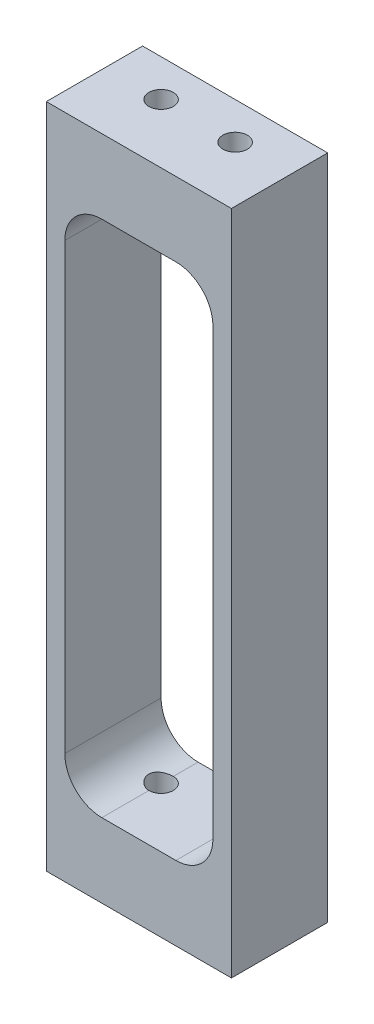
ISO-10303-21;
HEADER;
FILE_DESCRIPTION(('STEP AP214'),'2;1');
FILE_NAME('part.step','',(''),(''),'','','');
FILE_SCHEMA(('AUTOMOTIVE_DESIGN { 1 0 10303 214 1 1 1 1 }'));
ENDSEC;
DATA;
#1=APPLICATION_CONTEXT('core data for automotive mechanical design processes');
#2=APPLICATION_PROTOCOL_DEFINITION('international standard','automotive_design',2000,#1);
#3=PRODUCT_CONTEXT('',#1,'mechanical');
#4=PRODUCT('Part','Part','',(#3));
#5=PRODUCT_RELATED_PRODUCT_CATEGORY('part','',(#4));
#6=PRODUCT_DEFINITION_FORMATION('','',#4);
#7=PRODUCT_DEFINITION_CONTEXT('part definition',#1,'design');
#8=PRODUCT_DEFINITION('design','',#6,#7);
#9=PRODUCT_DEFINITION_SHAPE('','',#8);
#10=(LENGTH_UNIT() NAMED_UNIT(*) SI_UNIT(.MILLI.,.METRE.));
#11=(NAMED_UNIT(*) PLANE_ANGLE_UNIT() SI_UNIT($,.RADIAN.));
#12=(NAMED_UNIT(*) SI_UNIT($,.STERADIAN.) SOLID_ANGLE_UNIT());
#13=UNCERTAINTY_MEASURE_WITH_UNIT(LENGTH_MEASURE(1.E-05),#10,'distance_accuracy_value','');
#14=(GEOMETRIC_REPRESENTATION_CONTEXT(3) GLOBAL_UNCERTAINTY_ASSIGNED_CONTEXT((#13)) GLOBAL_UNIT_ASSIGNED_CONTEXT((#10,
#11,#12)) REPRESENTATION_CONTEXT('',''));
#15=CARTESIAN_POINT('',(0.,0.,0.));
#16=DIRECTION('',(0.,0.,1.));
#17=DIRECTION('',(1.,0.,0.));
#18=AXIS2_PLACEMENT_3D('',#15,#16,#17);
#19=CARTESIAN_POINT('',(12.5,-45.,13.));
#20=DIRECTION('',(-1.,0.,0.));
#21=DIRECTION('',(0.,0.,1.));
#22=AXIS2_PLACEMENT_3D('',#19,#20,#21);
#23=PLANE('',#22);
#24=DIRECTION('',(0.,1.,0.));
#25=VECTOR('',#24,1.);
#26=CARTESIAN_POINT('',(12.5,-45.,0.));
#27=LINE('',#26,#25);
#28=CARTESIAN_POINT('',(12.5,-45.,0.));
#29=VERTEX_POINT('',#28);
#30=CARTESIAN_POINT('',(12.5,45.,0.));
#31=VERTEX_POINT('',#30);
#32=EDGE_CURVE('E287',#29,#31,#27,.T.);
#33=ORIENTED_EDGE('',*,*,#32,.T.);
#34=DIRECTION('',(0.,0.,-1.));
#35=VECTOR('',#34,1.);
#36=CARTESIAN_POINT('',(12.5,45.,13.));
#37=LINE('',#36,#35);
#38=CARTESIAN_POINT('',(12.5,45.,13.));
#39=VERTEX_POINT('',#38);
#40=EDGE_CURVE('E325',#39,#31,#37,.T.);
#41=ORIENTED_EDGE('',*,*,#40,.F.);
#42=DIRECTION('',(0.,1.,0.));
#43=VECTOR('',#42,1.);
#44=CARTESIAN_POINT('',(12.5,-45.,13.));
#45=LINE('',#44,#43);
#46=CARTESIAN_POINT('',(12.5,-45.,13.));
#47=VERTEX_POINT('',#46);
#48=EDGE_CURVE('E288',#47,#39,#45,.T.);
#49=ORIENTED_EDGE('',*,*,#48,.F.);
#50=DIRECTION('',(0.,0.,-1.));
#51=VECTOR('',#50,1.);
#52=CARTESIAN_POINT('',(12.5,-45.,13.));
#53=LINE('',#52,#51);
#54=EDGE_CURVE('E302',#47,#29,#53,.T.);
#55=ORIENTED_EDGE('',*,*,#54,.T.);
#56=EDGE_LOOP('',(#33,#41,#49,#55));
#57=FACE_BOUND('',#56,.T.);
#58=ADVANCED_FACE('F43',(#57),#23,.F.);
#59=CARTESIAN_POINT('',(-12.5,45.,13.));
#60=DIRECTION('',(0.,-1.,0.));
#61=DIRECTION('',(0.,0.,-1.));
#62=AXIS2_PLACEMENT_3D('',#59,#60,#61);
#63=PLANE('',#62);
#64=CARTESIAN_POINT('',(5.,45.,5.));
#65=DIRECTION('',(0.,-1.,0.));
#66=DIRECTION('',(0.,0.,-1.));
#67=AXIS2_PLACEMENT_3D('',#64,#65,#66);
#68=CIRCLE('',#67,1.64999999999999);
#69=CARTESIAN_POINT('',(5.,45.,3.35000000000001));
#70=VERTEX_POINT('',#69);
#71=EDGE_CURVE('E174',#70,#70,#68,.T.);
#72=ORIENTED_EDGE('',*,*,#71,.T.);
#73=EDGE_LOOP('',(#72));
#74=FACE_BOUND('',#73,.T.);
#75=CARTESIAN_POINT('',(-5.,45.,5.));
#76=DIRECTION('',(0.,-1.,0.));
#77=DIRECTION('',(0.,0.,-1.));
#78=AXIS2_PLACEMENT_3D('',#75,#76,#77);
#79=CIRCLE('',#78,1.64999999999999);
#80=CARTESIAN_POINT('',(-5.,45.,3.35000000000001));
#81=VERTEX_POINT('',#80);
#82=EDGE_CURVE('E382',#81,#81,#79,.T.);
#83=ORIENTED_EDGE('',*,*,#82,.T.);
#84=EDGE_LOOP('',(#83));
#85=FACE_BOUND('',#84,.T.);
#86=DIRECTION('',(-1.,0.,0.));
#87=VECTOR('',#86,1.);
#88=CARTESIAN_POINT('',(-12.5,45.,0.));
#89=LINE('',#88,#87);
#90=CARTESIAN_POINT('',(-12.5,45.,0.));
#91=VERTEX_POINT('',#90);
#92=EDGE_CURVE('E306',#31,#91,#89,.T.);
#93=ORIENTED_EDGE('',*,*,#92,.T.);
#94=DIRECTION('',(0.,0.,-1.));
#95=VECTOR('',#94,1.);
#96=CARTESIAN_POINT('',(-12.5,45.,13.));
#97=LINE('',#96,#95);
#98=CARTESIAN_POINT('',(-12.5,45.,13.));
#99=VERTEX_POINT('',#98);
#100=EDGE_CURVE('E321',#99,#91,#97,.T.);
#101=ORIENTED_EDGE('',*,*,#100,.F.);
#102=DIRECTION('',(-1.,0.,0.));
#103=VECTOR('',#102,1.);
#104=CARTESIAN_POINT('',(-12.5,45.,13.));
#105=LINE('',#104,#103);
#106=EDGE_CURVE('E292',#39,#99,#105,.T.);
#107=ORIENTED_EDGE('',*,*,#106,.F.);
#108=ORIENTED_EDGE('',*,*,#40,.T.);
#109=EDGE_LOOP('',(#93,#101,#107,#108));
#110=FACE_BOUND('',#109,.T.);
#111=ADVANCED_FACE('F408',(#74,#85,#110),#63,.F.);
#112=CARTESIAN_POINT('',(-12.5,-45.,13.));
#113=DIRECTION('',(1.,0.,0.));
#114=DIRECTION('',(0.,0.,-1.));
#115=AXIS2_PLACEMENT_3D('',#112,#113,#114);
#116=PLANE('',#115);
#117=DIRECTION('',(0.,-1.,0.));
#118=VECTOR('',#117,1.);
#119=CARTESIAN_POINT('',(-12.5,-45.,0.));
#120=LINE('',#119,#118);
#121=CARTESIAN_POINT('',(-12.5,-45.,0.));
#122=VERTEX_POINT('',#121);
#123=EDGE_CURVE('E309',#91,#122,#120,.T.);
#124=ORIENTED_EDGE('',*,*,#123,.T.);
#125=DIRECTION('',(0.,0.,-1.));
#126=VECTOR('',#125,1.);
#127=CARTESIAN_POINT('',(-12.5,-45.,13.));
#128=LINE('',#127,#126);
#129=CARTESIAN_POINT('',(-12.5,-45.,13.));
#130=VERTEX_POINT('',#129);
#131=EDGE_CURVE('E317',#130,#122,#128,.T.);
#132=ORIENTED_EDGE('',*,*,#131,.F.);
#133=DIRECTION('',(0.,-1.,0.));
#134=VECTOR('',#133,1.);
#135=CARTESIAN_POINT('',(-12.5,-45.,13.));
#136=LINE('',#135,#134);
#137=EDGE_CURVE('E296',#99,#130,#136,.T.);
#138=ORIENTED_EDGE('',*,*,#137,.F.);
#139=ORIENTED_EDGE('',*,*,#100,.T.);
#140=EDGE_LOOP('',(#124,#132,#138,#139));
#141=FACE_BOUND('',#140,.T.);
#142=ADVANCED_FACE('F413',(#141),#116,.F.);
#143=CARTESIAN_POINT('',(-12.5,-45.,13.));
#144=DIRECTION('',(0.,1.,0.));
#145=DIRECTION('',(0.,0.,1.));
#146=AXIS2_PLACEMENT_3D('',#143,#144,#145);
#147=PLANE('',#146);
#148=CARTESIAN_POINT('',(5.,-45.,5.));
#149=DIRECTION('',(0.,-1.,0.));
#150=DIRECTION('',(0.,0.,-1.));
#151=AXIS2_PLACEMENT_3D('',#148,#149,#150);
#152=CIRCLE('',#151,1.65);
#153=CARTESIAN_POINT('',(5.,-45.,3.35));
#154=VERTEX_POINT('',#153);
#155=EDGE_CURVE('E510',#154,#154,#152,.T.);
#156=ORIENTED_EDGE('',*,*,#155,.F.);
#157=EDGE_LOOP('',(#156));
#158=FACE_BOUND('',#157,.T.);
#159=CARTESIAN_POINT('',(-5.,-45.,5.));
#160=DIRECTION('',(0.,-1.,0.));
#161=DIRECTION('',(0.,0.,-1.));
#162=AXIS2_PLACEMENT_3D('',#159,#160,#161);
#163=CIRCLE('',#162,1.65);
#164=CARTESIAN_POINT('',(-5.,-45.,3.35));
#165=VERTEX_POINT('',#164);
#166=EDGE_CURVE('E385',#165,#165,#163,.T.);
#167=ORIENTED_EDGE('',*,*,#166,.F.);
#168=EDGE_LOOP('',(#167));
#169=FACE_BOUND('',#168,.T.);
#170=DIRECTION('',(1.,0.,0.));
#171=VECTOR('',#170,1.);
#172=CARTESIAN_POINT('',(-12.5,-45.,0.));
#173=LINE('',#172,#171);
#174=EDGE_CURVE('E293',#122,#29,#173,.T.);
#175=ORIENTED_EDGE('',*,*,#174,.T.);
#176=ORIENTED_EDGE('',*,*,#54,.F.);
#177=DIRECTION('',(1.,0.,0.));
#178=VECTOR('',#177,1.);
#179=CARTESIAN_POINT('',(-12.5,-45.,13.));
#180=LINE('',#179,#178);
#181=EDGE_CURVE('E299',#130,#47,#180,.T.);
#182=ORIENTED_EDGE('',*,*,#181,.F.);
#183=ORIENTED_EDGE('',*,*,#131,.T.);
#184=EDGE_LOOP('',(#175,#176,#182,#183));
#185=FACE_BOUND('',#184,.T.);
#186=ADVANCED_FACE('F419',(#158,#169,#185),#147,.F.);
#187=CARTESIAN_POINT('',(0.,0.,13.));
#188=DIRECTION('',(0.,0.,-1.));
#189=DIRECTION('',(-1.,0.,0.));
#190=AXIS2_PLACEMENT_3D('',#187,#188,#189);
#191=PLANE('',#190);
#192=DIRECTION('',(-1.,0.,0.));
#193=VECTOR('',#192,1.);
#194=CARTESIAN_POINT('',(-10.,35.,13.));
#195=LINE('',#194,#193);
#196=CARTESIAN_POINT('',(5.,35.,13.));
#197=VERTEX_POINT('',#196);
#198=CARTESIAN_POINT('',(-5.,35.,13.));
#199=VERTEX_POINT('',#198);
#200=EDGE_CURVE('E276',#197,#199,#195,.T.);
#201=ORIENTED_EDGE('',*,*,#200,.F.);
#202=CARTESIAN_POINT('',(5.,30.,13.));
#203=DIRECTION('',(0.,0.,-1.));
#204=DIRECTION('',(-1.,0.,0.));
#205=AXIS2_PLACEMENT_3D('',#202,#203,#204);
#206=CIRCLE('',#205,5.);
#207=CARTESIAN_POINT('',(10.,30.,13.));
#208=VERTEX_POINT('',#207);
#209=EDGE_CURVE('E178',#197,#208,#206,.T.);
#210=ORIENTED_EDGE('',*,*,#209,.T.);
#211=DIRECTION('',(0.,1.,0.));
#212=VECTOR('',#211,1.);
#213=CARTESIAN_POINT('',(10.,-35.,13.));
#214=LINE('',#213,#212);
#215=CARTESIAN_POINT('',(10.,-30.,13.));
#216=VERTEX_POINT('',#215);
#217=EDGE_CURVE('E272',#216,#208,#214,.T.);
#218=ORIENTED_EDGE('',*,*,#217,.F.);
#219=CARTESIAN_POINT('',(5.,-30.,13.));
#220=DIRECTION('',(0.,0.,-1.));
#221=DIRECTION('',(-1.,0.,0.));
#222=AXIS2_PLACEMENT_3D('',#219,#220,#221);
#223=CIRCLE('',#222,5.);
#224=CARTESIAN_POINT('',(5.,-35.,13.));
#225=VERTEX_POINT('',#224);
#226=EDGE_CURVE('E223',#216,#225,#223,.T.);
#227=ORIENTED_EDGE('',*,*,#226,.T.);
#228=DIRECTION('',(1.,0.,0.));
#229=VECTOR('',#228,1.);
#230=CARTESIAN_POINT('',(-10.,-35.,13.));
#231=LINE('',#230,#229);
#232=CARTESIAN_POINT('',(-5.,-35.,13.));
#233=VERTEX_POINT('',#232);
#234=EDGE_CURVE('E283',#233,#225,#231,.T.);
#235=ORIENTED_EDGE('',*,*,#234,.F.);
#236=CARTESIAN_POINT('',(-5.,-30.,13.));
#237=DIRECTION('',(0.,0.,-1.));
#238=DIRECTION('',(-1.,0.,0.));
#239=AXIS2_PLACEMENT_3D('',#236,#237,#238);
#240=CIRCLE('',#239,5.);
#241=CARTESIAN_POINT('',(-10.,-30.,13.));
#242=VERTEX_POINT('',#241);
#243=EDGE_CURVE('E229',#233,#242,#240,.T.);
#244=ORIENTED_EDGE('',*,*,#243,.T.);
#245=DIRECTION('',(0.,-1.,0.));
#246=VECTOR('',#245,1.);
#247=CARTESIAN_POINT('',(-10.,-35.,13.));
#248=LINE('',#247,#246);
#249=CARTESIAN_POINT('',(-10.,30.,13.));
#250=VERTEX_POINT('',#249);
#251=EDGE_CURVE('E279',#250,#242,#248,.T.);
#252=ORIENTED_EDGE('',*,*,#251,.F.);
#253=CARTESIAN_POINT('',(-5.,30.,13.));
#254=DIRECTION('',(0.,0.,-1.));
#255=DIRECTION('',(-1.,0.,0.));
#256=AXIS2_PLACEMENT_3D('',#253,#254,#255);
#257=CIRCLE('',#256,5.);
#258=EDGE_CURVE('E212',#250,#199,#257,.T.);
#259=ORIENTED_EDGE('',*,*,#258,.T.);
#260=EDGE_LOOP('',(#201,#210,#218,#227,#235,#244,#252,#259));
#261=FACE_BOUND('',#260,.T.);
#262=ORIENTED_EDGE('',*,*,#48,.T.);
#263=ORIENTED_EDGE('',*,*,#106,.T.);
#264=ORIENTED_EDGE('',*,*,#137,.T.);
#265=ORIENTED_EDGE('',*,*,#181,.T.);
#266=EDGE_LOOP('',(#262,#263,#264,#265));
#267=FACE_BOUND('',#266,.T.);
#268=ADVANCED_FACE('F373',(#261,#267),#191,.F.);
#269=CARTESIAN_POINT('',(0.,0.,0.));
#270=DIRECTION('',(0.,0.,-1.));
#271=DIRECTION('',(-1.,0.,0.));
#272=AXIS2_PLACEMENT_3D('',#269,#270,#271);
#273=PLANE('',#272);
#274=DIRECTION('',(0.,-1.,0.));
#275=VECTOR('',#274,1.);
#276=CARTESIAN_POINT('',(10.,0.,0.));
#277=LINE('',#276,#275);
#278=CARTESIAN_POINT('',(10.,30.,0.));
#279=VERTEX_POINT('',#278);
#280=CARTESIAN_POINT('',(10.,-30.,0.));
#281=VERTEX_POINT('',#280);
#282=EDGE_CURVE('E340',#279,#281,#277,.T.);
#283=ORIENTED_EDGE('',*,*,#282,.F.);
#284=CARTESIAN_POINT('',(5.,30.,0.));
#285=DIRECTION('',(0.,0.,-1.));
#286=DIRECTION('',(-1.,0.,0.));
#287=AXIS2_PLACEMENT_3D('',#284,#285,#286);
#288=CIRCLE('',#287,5.);
#289=CARTESIAN_POINT('',(5.,35.,0.));
#290=VERTEX_POINT('',#289);
#291=EDGE_CURVE('E220',#279,#290,#288,.F.);
#292=ORIENTED_EDGE('',*,*,#291,.T.);
#293=DIRECTION('',(1.,0.,0.));
#294=VECTOR('',#293,1.);
#295=CARTESIAN_POINT('',(0.,35.,0.));
#296=LINE('',#295,#294);
#297=CARTESIAN_POINT('',(-5.,35.,0.));
#298=VERTEX_POINT('',#297);
#299=EDGE_CURVE('E329',#298,#290,#296,.T.);
#300=ORIENTED_EDGE('',*,*,#299,.F.);
#301=CARTESIAN_POINT('',(-5.,30.,0.));
#302=DIRECTION('',(0.,0.,-1.));
#303=DIRECTION('',(-1.,0.,0.));
#304=AXIS2_PLACEMENT_3D('',#301,#302,#303);
#305=CIRCLE('',#304,5.);
#306=CARTESIAN_POINT('',(-10.,30.,0.));
#307=VERTEX_POINT('',#306);
#308=EDGE_CURVE('E215',#298,#307,#305,.F.);
#309=ORIENTED_EDGE('',*,*,#308,.T.);
#310=DIRECTION('',(0.,1.,0.));
#311=VECTOR('',#310,1.);
#312=CARTESIAN_POINT('',(-10.,0.,0.));
#313=LINE('',#312,#311);
#314=CARTESIAN_POINT('',(-10.,-30.,0.));
#315=VERTEX_POINT('',#314);
#316=EDGE_CURVE('E332',#315,#307,#313,.T.);
#317=ORIENTED_EDGE('',*,*,#316,.F.);
#318=CARTESIAN_POINT('',(-5.,-30.,0.));
#319=DIRECTION('',(0.,0.,-1.));
#320=DIRECTION('',(-1.,0.,0.));
#321=AXIS2_PLACEMENT_3D('',#318,#319,#320);
#322=CIRCLE('',#321,5.);
#323=CARTESIAN_POINT('',(-5.,-35.,0.));
#324=VERTEX_POINT('',#323);
#325=EDGE_CURVE('E232',#315,#324,#322,.F.);
#326=ORIENTED_EDGE('',*,*,#325,.T.);
#327=DIRECTION('',(-1.,0.,0.));
#328=VECTOR('',#327,1.);
#329=CARTESIAN_POINT('',(0.,-35.,0.));
#330=LINE('',#329,#328);
#331=CARTESIAN_POINT('',(5.,-35.,0.));
#332=VERTEX_POINT('',#331);
#333=EDGE_CURVE('E336',#332,#324,#330,.T.);
#334=ORIENTED_EDGE('',*,*,#333,.F.);
#335=CARTESIAN_POINT('',(5.,-30.,0.));
#336=DIRECTION('',(0.,0.,-1.));
#337=DIRECTION('',(-1.,0.,0.));
#338=AXIS2_PLACEMENT_3D('',#335,#336,#337);
#339=CIRCLE('',#338,5.);
#340=EDGE_CURVE('E226',#332,#281,#339,.F.);
#341=ORIENTED_EDGE('',*,*,#340,.T.);
#342=EDGE_LOOP('',(#283,#292,#300,#309,#317,#326,#334,#341));
#343=FACE_BOUND('',#342,.T.);
#344=ORIENTED_EDGE('',*,*,#32,.F.);
#345=ORIENTED_EDGE('',*,*,#174,.F.);
#346=ORIENTED_EDGE('',*,*,#123,.F.);
#347=ORIENTED_EDGE('',*,*,#92,.F.);
#348=EDGE_LOOP('',(#344,#345,#346,#347));
#349=FACE_BOUND('',#348,.T.);
#350=ADVANCED_FACE('F355',(#343,#349),#273,.T.);
#351=CARTESIAN_POINT('',(10.,-35.,-10.));
#352=DIRECTION('',(1.,0.,0.));
#353=DIRECTION('',(0.,0.,-1.));
#354=AXIS2_PLACEMENT_3D('',#351,#352,#353);
#355=PLANE('',#354);
#356=ORIENTED_EDGE('',*,*,#217,.T.);
#357=DIRECTION('',(0.,0.,1.));
#358=VECTOR('',#357,1.);
#359=CARTESIAN_POINT('',(10.,30.,0.));
#360=LINE('',#359,#358);
#361=EDGE_CURVE('E199',#208,#279,#360,.F.);
#362=ORIENTED_EDGE('',*,*,#361,.T.);
#363=ORIENTED_EDGE('',*,*,#282,.T.);
#364=DIRECTION('',(0.,0.,1.));
#365=VECTOR('',#364,1.);
#366=CARTESIAN_POINT('',(10.,-30.,13.));
#367=LINE('',#366,#365);
#368=EDGE_CURVE('E195',#281,#216,#367,.T.);
#369=ORIENTED_EDGE('',*,*,#368,.T.);
#370=EDGE_LOOP('',(#356,#362,#363,#369));
#371=FACE_BOUND('',#370,.T.);
#372=ADVANCED_FACE('F371',(#371),#355,.F.);
#373=CARTESIAN_POINT('',(-10.,-35.,-10.));
#374=DIRECTION('',(0.,-1.,0.));
#375=DIRECTION('',(0.,0.,-1.));
#376=AXIS2_PLACEMENT_3D('',#373,#374,#375);
#377=PLANE('',#376);
#378=DIRECTION('',(0.,0.,1.));
#379=VECTOR('',#378,1.);
#380=CARTESIAN_POINT('',(5.,-35.,0.));
#381=LINE('',#380,#379);
#382=CARTESIAN_POINT('',(5.,-35.,6.64999999999999));
#383=VERTEX_POINT('',#382);
#384=EDGE_CURVE('E208',#225,#383,#381,.F.);
#385=ORIENTED_EDGE('',*,*,#384,.T.);
#386=CARTESIAN_POINT('',(5.,-35.,5.));
#387=DIRECTION('',(0.,-1.,0.));
#388=DIRECTION('',(0.,0.,-1.));
#389=AXIS2_PLACEMENT_3D('',#386,#387,#388);
#390=CIRCLE('',#389,1.64999999999999);
#391=CARTESIAN_POINT('',(5.,-35.,3.35000000000001));
#392=VERTEX_POINT('',#391);
#393=EDGE_CURVE('E65',#383,#392,#390,.T.);
#394=ORIENTED_EDGE('',*,*,#393,.T.);
#395=EDGE_CURVE('E207',#392,#332,#381,.F.);
#396=ORIENTED_EDGE('',*,*,#395,.T.);
#397=ORIENTED_EDGE('',*,*,#333,.T.);
#398=DIRECTION('',(0.,0.,1.));
#399=VECTOR('',#398,1.);
#400=CARTESIAN_POINT('',(-5.,-35.,13.));
#401=LINE('',#400,#399);
#402=CARTESIAN_POINT('',(-5.,-35.,3.35000000000001));
#403=VERTEX_POINT('',#402);
#404=EDGE_CURVE('E203',#324,#403,#401,.T.);
#405=ORIENTED_EDGE('',*,*,#404,.T.);
#406=CARTESIAN_POINT('',(-5.,-35.,5.));
#407=DIRECTION('',(0.,-1.,0.));
#408=DIRECTION('',(0.,0.,-1.));
#409=AXIS2_PLACEMENT_3D('',#406,#407,#408);
#410=CIRCLE('',#409,1.64999999999999);
#411=CARTESIAN_POINT('',(-5.,-35.,6.64999999999999));
#412=VERTEX_POINT('',#411);
#413=EDGE_CURVE('E266',#403,#412,#410,.T.);
#414=ORIENTED_EDGE('',*,*,#413,.T.);
#415=EDGE_CURVE('E202',#412,#233,#401,.T.);
#416=ORIENTED_EDGE('',*,*,#415,.T.);
#417=ORIENTED_EDGE('',*,*,#234,.T.);
#418=EDGE_LOOP('',(#385,#394,#396,#397,#405,#414,#416,#417));
#419=FACE_BOUND('',#418,.T.);
#420=ADVANCED_FACE('F253',(#419),#377,.F.);
#421=CARTESIAN_POINT('',(-10.,-35.,-10.));
#422=DIRECTION('',(-1.,0.,0.));
#423=DIRECTION('',(0.,0.,1.));
#424=AXIS2_PLACEMENT_3D('',#421,#422,#423);
#425=PLANE('',#424);
#426=ORIENTED_EDGE('',*,*,#316,.T.);
#427=DIRECTION('',(0.,0.,1.));
#428=VECTOR('',#427,1.);
#429=CARTESIAN_POINT('',(-10.,30.,13.));
#430=LINE('',#429,#428);
#431=EDGE_CURVE('E181',#307,#250,#430,.T.);
#432=ORIENTED_EDGE('',*,*,#431,.T.);
#433=ORIENTED_EDGE('',*,*,#251,.T.);
#434=DIRECTION('',(0.,0.,1.));
#435=VECTOR('',#434,1.);
#436=CARTESIAN_POINT('',(-10.,-30.,0.));
#437=LINE('',#436,#435);
#438=EDGE_CURVE('E187',#242,#315,#437,.F.);
#439=ORIENTED_EDGE('',*,*,#438,.T.);
#440=EDGE_LOOP('',(#426,#432,#433,#439));
#441=FACE_BOUND('',#440,.T.);
#442=ADVANCED_FACE('F347',(#441),#425,.F.);
#443=CARTESIAN_POINT('',(-10.,35.,-10.));
#444=DIRECTION('',(0.,1.,0.));
#445=DIRECTION('',(0.,0.,1.));
#446=AXIS2_PLACEMENT_3D('',#443,#444,#445);
#447=PLANE('',#446);
#448=DIRECTION('',(0.,0.,1.));
#449=VECTOR('',#448,1.);
#450=CARTESIAN_POINT('',(5.,35.,13.));
#451=LINE('',#450,#449);
#452=CARTESIAN_POINT('',(5.,35.,3.35000000000001));
#453=VERTEX_POINT('',#452);
#454=EDGE_CURVE('E171',#290,#453,#451,.T.);
#455=ORIENTED_EDGE('',*,*,#454,.T.);
#456=CARTESIAN_POINT('',(5.,35.,5.));
#457=DIRECTION('',(0.,1.,0.));
#458=DIRECTION('',(0.,0.,1.));
#459=AXIS2_PLACEMENT_3D('',#456,#457,#458);
#460=CIRCLE('',#459,1.64999999999999);
#461=CARTESIAN_POINT('',(5.,35.,6.64999999999999));
#462=VERTEX_POINT('',#461);
#463=EDGE_CURVE('E72',#453,#462,#460,.T.);
#464=ORIENTED_EDGE('',*,*,#463,.T.);
#465=EDGE_CURVE('E168',#462,#197,#451,.T.);
#466=ORIENTED_EDGE('',*,*,#465,.T.);
#467=ORIENTED_EDGE('',*,*,#200,.T.);
#468=DIRECTION('',(0.,0.,1.));
#469=VECTOR('',#468,1.);
#470=CARTESIAN_POINT('',(-5.,35.,0.));
#471=LINE('',#470,#469);
#472=CARTESIAN_POINT('',(-5.,35.,6.64999999999999));
#473=VERTEX_POINT('',#472);
#474=EDGE_CURVE('E191',#199,#473,#471,.F.);
#475=ORIENTED_EDGE('',*,*,#474,.T.);
#476=CARTESIAN_POINT('',(-5.,35.,5.));
#477=DIRECTION('',(0.,1.,0.));
#478=DIRECTION('',(0.,0.,1.));
#479=AXIS2_PLACEMENT_3D('',#476,#477,#478);
#480=CIRCLE('',#479,1.64999999999999);
#481=CARTESIAN_POINT('',(-5.,35.,3.35000000000001));
#482=VERTEX_POINT('',#481);
#483=EDGE_CURVE('E267',#473,#482,#480,.T.);
#484=ORIENTED_EDGE('',*,*,#483,.T.);
#485=EDGE_CURVE('E185',#482,#298,#471,.F.);
#486=ORIENTED_EDGE('',*,*,#485,.T.);
#487=ORIENTED_EDGE('',*,*,#299,.T.);
#488=EDGE_LOOP('',(#455,#464,#466,#467,#475,#484,#486,#487));
#489=FACE_BOUND('',#488,.T.);
#490=ADVANCED_FACE('F166',(#489),#447,.F.);
#491=CARTESIAN_POINT('',(-5.,30.,-10.));
#492=DIRECTION('',(0.,0.,-1.));
#493=DIRECTION('',(-1.,0.,0.));
#494=AXIS2_PLACEMENT_3D('',#491,#492,#493);
#495=CYLINDRICAL_SURFACE('',#494,5.);
#496=ORIENTED_EDGE('',*,*,#485,.F.);
#497=CARTESIAN_POINT('',(-5.,35.,3.35000000000001));
#498=CARTESIAN_POINT('',(-5.04512523995191,35.000003305588,3.34999897749011));
#499=CARTESIAN_POINT('',(-5.09022774767274,34.9993883869461,3.35185237312601));
#500=CARTESIAN_POINT('',(-5.18008791393167,34.9969574176636,3.35923755776689));
#501=CARTESIAN_POINT('',(-5.22484564818825,34.9951416388296,3.3647685143823));
#502=CARTESIAN_POINT('',(-5.35786726126012,34.9879626019524,3.38678101439285));
#503=CARTESIAN_POINT('',(-5.44520467084122,34.9808671371979,3.40868270006664));
#504=CARTESIAN_POINT('',(-5.61472023985656,34.9628021638047,3.46616783567919));
#505=CARTESIAN_POINT('',(-5.69690024972775,34.95183405411,3.50174634544884));
#506=CARTESIAN_POINT('',(-5.85416437922754,34.9271435524924,3.58548889932076));
#507=CARTESIAN_POINT('',(-5.92924499868198,34.9134198122833,3.63365910783741));
#508=CARTESIAN_POINT('',(-6.07267644121514,34.884147019198,3.74292365638605));
#509=CARTESIAN_POINT('',(-6.14075225973356,34.8685550693567,3.8043672855782));
#510=CARTESIAN_POINT('',(-6.26584763166015,34.8375397669077,3.93769627513977));
#511=CARTESIAN_POINT('',(-6.32286431959175,34.8221164589701,4.0095843332968));
#512=CARTESIAN_POINT('',(-6.42578276226329,34.792712810478,4.16423231219205));
#513=CARTESIAN_POINT('',(-6.47132745993604,34.7787851483645,4.24724082866695));
#514=CARTESIAN_POINT('',(-6.5476908126826,34.7546050502667,4.42026951872934));
#515=CARTESIAN_POINT('',(-6.5785144923046,34.7443513605885,4.51028728771461));
#516=CARTESIAN_POINT('',(-6.62353112321163,34.7291329048862,4.69164389510025));
#517=CARTESIAN_POINT('',(-6.63824103676309,34.7240042286797,4.78284025401816));
#518=CARTESIAN_POINT('',(-6.65222862373071,34.7191313422226,4.96654167720084));
#519=CARTESIAN_POINT('',(-6.65151063245312,34.7193856193392,5.05904636651772));
#520=CARTESIAN_POINT('',(-6.63506405388395,34.7251063079957,5.23834773775523));
#521=CARTESIAN_POINT('',(-6.62000751765722,34.7303393530955,5.32521479556291));
#522=CARTESIAN_POINT('',(-6.57640673587477,34.7450464404326,5.49511192005411));
#523=CARTESIAN_POINT('',(-6.547861069562,34.754520929399,5.57814158154822));
#524=CARTESIAN_POINT('',(-6.47764664319772,34.7768117776195,5.73954771337591));
#525=CARTESIAN_POINT('',(-6.43577672452482,34.7896788071856,5.8178293755282));
#526=CARTESIAN_POINT('',(-6.3402419810266,34.8172832592443,5.96646884754385));
#527=CARTESIAN_POINT('',(-6.28657388383099,34.8320212001771,6.0368244508125));
#528=CARTESIAN_POINT('',(-6.16573352684727,34.8626266650481,6.1713894079499));
#529=CARTESIAN_POINT('',(-6.09801200517744,34.8785134578004,6.23510207533903));
#530=CARTESIAN_POINT('',(-5.95263432086684,34.9089708790077,6.35040554307254));
#531=CARTESIAN_POINT('',(-5.87497557867233,34.9235411640355,6.4019931860431));
#532=CARTESIAN_POINT('',(-5.71087621339482,34.9499118656368,6.49197899931057));
#533=CARTESIAN_POINT('',(-5.62435522257238,34.9616829930909,6.53023949640468));
#534=CARTESIAN_POINT('',(-5.44566716112133,34.9809048104991,6.59146711652926));
#535=CARTESIAN_POINT('',(-5.35350862373468,34.9883618598612,6.61445675786973));
#536=CARTESIAN_POINT('',(-5.21705219619393,34.9954738176149,6.63624345784355));
#537=CARTESIAN_POINT('',(-5.17379013102429,34.9971673716292,6.64140064332852));
#538=CARTESIAN_POINT('',(-5.08702628171975,34.9994307897298,6.64827636361463));
#539=CARTESIAN_POINT('',(-5.04352492424601,35.0000022430363,6.64999976170566));
#540=CARTESIAN_POINT('',(-5.00000000000003,35.,6.65000000000013));
#541=B_SPLINE_CURVE_WITH_KNOTS('',3,(#497,#498,#499,#500,#501,#502,#503,#504,#505,#506,#507,
#508,#509,#510,#511,#512,#513,#514,#515,#516,#517,#518,#519,#520,#521,#522,#523,#524,#525,#526,
#527,#528,#529,#530,#531,#532,#533,#534,#535,#536,#537,#538,#539,#540),.UNSPECIFIED.,.F.,.F.,(4,
2,2,2,2,2,2,2,2,2,2,2,2,2,2,2,2,2,2,2,2,4),(0.,0.135288962986928,0.270547314706137,
0.540101565824287,0.809558543319873,1.07914768451714,1.35695695895079,1.63483811929397,
1.9205220440407,2.2061083899159,2.4822368188036,2.75828765545487,3.02200556057787,
3.28575124826422,3.55368440526658,3.82169197080617,4.10337260569289,4.38512650955776,
4.6697102283806,4.9538733646636,5.08454912306488,5.2150396728159),.UNSPECIFIED.);
#542=EDGE_CURVE('E59',#482,#473,#541,.T.);
#543=ORIENTED_EDGE('',*,*,#542,.T.);
#544=ORIENTED_EDGE('',*,*,#474,.F.);
#545=ORIENTED_EDGE('',*,*,#258,.F.);
#546=ORIENTED_EDGE('',*,*,#431,.F.);
#547=ORIENTED_EDGE('',*,*,#308,.F.);
#548=EDGE_LOOP('',(#496,#543,#544,#545,#546,#547));
#549=FACE_BOUND('',#548,.T.);
#550=ADVANCED_FACE('F242',(#549),#495,.F.);
#551=CARTESIAN_POINT('',(5.,30.,-10.));
#552=DIRECTION('',(0.,0.,-1.));
#553=DIRECTION('',(-1.,0.,0.));
#554=AXIS2_PLACEMENT_3D('',#551,#552,#553);
#555=CYLINDRICAL_SURFACE('',#554,5.);
#556=ORIENTED_EDGE('',*,*,#465,.F.);
#557=CARTESIAN_POINT('',(5.,35.,6.64999999999999));
#558=CARTESIAN_POINT('',(5.0451252399519,35.000003305588,6.65000102250989));
#559=CARTESIAN_POINT('',(5.09022774767274,34.9993883869461,6.64814762687399));
#560=CARTESIAN_POINT('',(5.18008791393166,34.9969574176636,6.64076244223311));
#561=CARTESIAN_POINT('',(5.22484564818824,34.9951416388296,6.6352314856177));
#562=CARTESIAN_POINT('',(5.35786726126011,34.9879626019524,6.61321898560715));
#563=CARTESIAN_POINT('',(5.44520467084121,34.980867137198,6.59131729993336));
#564=CARTESIAN_POINT('',(5.61472023985655,34.9628021638047,6.53383216432081));
#565=CARTESIAN_POINT('',(5.69690024972774,34.95183405411,6.49825365455116));
#566=CARTESIAN_POINT('',(5.85416437922753,34.9271435524924,6.41451110067924));
#567=CARTESIAN_POINT('',(5.92924499868198,34.9134198122833,6.36634089216259));
#568=CARTESIAN_POINT('',(6.07267644121513,34.884147019198,6.25707634361396));
#569=CARTESIAN_POINT('',(6.14075225973356,34.8685550693567,6.1956327144218));
#570=CARTESIAN_POINT('',(6.26584763166015,34.8375397669077,6.06230372486023));
#571=CARTESIAN_POINT('',(6.32286431959175,34.8221164589701,5.99041566670321));
#572=CARTESIAN_POINT('',(6.42578276226329,34.792712810478,5.83576768780796));
#573=CARTESIAN_POINT('',(6.47132745993604,34.7787851483645,5.75275917133306));
#574=CARTESIAN_POINT('',(6.5476908126826,34.7546050502667,5.57973048127067));
#575=CARTESIAN_POINT('',(6.57851449230459,34.7443513605885,5.4897127122854));
#576=CARTESIAN_POINT('',(6.62353112321163,34.7291329048862,5.30835610489976));
#577=CARTESIAN_POINT('',(6.63824103676308,34.7240042286797,5.21715974598185));
#578=CARTESIAN_POINT('',(6.65222862373071,34.7191313422226,5.03345832279917));
#579=CARTESIAN_POINT('',(6.65151063245312,34.7193856193392,4.94095363348229));
#580=CARTESIAN_POINT('',(6.63506405388395,34.7251063079957,4.76165226224478));
#581=CARTESIAN_POINT('',(6.62000751765722,34.7303393530955,4.6747852044371));
#582=CARTESIAN_POINT('',(6.57640673587477,34.7450464404326,4.5048880799459));
#583=CARTESIAN_POINT('',(6.54786106956201,34.754520929399,4.42185841845178));
#584=CARTESIAN_POINT('',(6.47764664319772,34.7768117776195,4.2604522866241));
#585=CARTESIAN_POINT('',(6.43577672452482,34.7896788071856,4.18217062447181));
#586=CARTESIAN_POINT('',(6.34024198102661,34.8172832592443,4.03353115245616));
#587=CARTESIAN_POINT('',(6.286573883831,34.8320212001771,3.96317554918751));
#588=CARTESIAN_POINT('',(6.16573352684728,34.8626266650481,3.8286105920501));
#589=CARTESIAN_POINT('',(6.09801200517744,34.8785134578004,3.76489792466098));
#590=CARTESIAN_POINT('',(5.95263432086685,34.9089708790077,3.64959445692746));
#591=CARTESIAN_POINT('',(5.87497557867234,34.9235411640355,3.5980068139569));
#592=CARTESIAN_POINT('',(5.71087621339483,34.9499118656368,3.50802100068943));
#593=CARTESIAN_POINT('',(5.62435522257239,34.9616829930909,3.46976050359533));
#594=CARTESIAN_POINT('',(5.44566716112134,34.9809048104991,3.40853288347074));
#595=CARTESIAN_POINT('',(5.35350862373469,34.9883618598612,3.38554324213027));
#596=CARTESIAN_POINT('',(5.21705219619394,34.9954738176149,3.36375654215645));
#597=CARTESIAN_POINT('',(5.1737901310243,34.9971673716292,3.35859935667148));
#598=CARTESIAN_POINT('',(5.08702628171975,34.9994307897298,3.35172363638537));
#599=CARTESIAN_POINT('',(5.043524924246,35.0000022430363,3.35000023829433));
#600=CARTESIAN_POINT('',(5.00000000000002,35.,3.34999999999987));
#601=B_SPLINE_CURVE_WITH_KNOTS('',3,(#557,#558,#559,#560,#561,#562,#563,#564,#565,#566,#567,
#568,#569,#570,#571,#572,#573,#574,#575,#576,#577,#578,#579,#580,#581,#582,#583,#584,#585,#586,
#587,#588,#589,#590,#591,#592,#593,#594,#595,#596,#597,#598,#599,#600),.UNSPECIFIED.,.F.,.F.,(4,
2,2,2,2,2,2,2,2,2,2,2,2,2,2,2,2,2,2,2,2,4),(0.,0.135288962986927,0.270547314706135,
0.540101565824286,0.809558543319872,1.07914768451714,1.35695695895079,1.63483811929397,
1.9205220440407,2.2061083899159,2.4822368188036,2.75828765545487,3.02200556057787,
3.28575124826422,3.55368440526658,3.82169197080617,4.10337260569288,4.38512650955776,
4.6697102283806,4.9538733646636,5.08454912306489,5.21503967281591),.UNSPECIFIED.);
#602=EDGE_CURVE('E11',#462,#453,#601,.T.);
#603=ORIENTED_EDGE('',*,*,#602,.T.);
#604=ORIENTED_EDGE('',*,*,#454,.F.);
#605=ORIENTED_EDGE('',*,*,#291,.F.);
#606=ORIENTED_EDGE('',*,*,#361,.F.);
#607=ORIENTED_EDGE('',*,*,#209,.F.);
#608=EDGE_LOOP('',(#556,#603,#604,#605,#606,#607));
#609=FACE_BOUND('',#608,.T.);
#610=ADVANCED_FACE('F176',(#609),#555,.F.);
#611=CARTESIAN_POINT('',(5.,-30.,-10.));
#612=DIRECTION('',(0.,0.,-1.));
#613=DIRECTION('',(-1.,0.,0.));
#614=AXIS2_PLACEMENT_3D('',#611,#612,#613);
#615=CYLINDRICAL_SURFACE('',#614,5.);
#616=ORIENTED_EDGE('',*,*,#395,.F.);
#617=CARTESIAN_POINT('',(5.,-35.,3.35000000000001));
#618=CARTESIAN_POINT('',(5.0451252399519,-35.000003305588,3.34999897749011));
#619=CARTESIAN_POINT('',(5.09022774767274,-34.9993883869461,3.35185237312601));
#620=CARTESIAN_POINT('',(5.18008791393166,-34.9969574176636,3.35923755776689));
#621=CARTESIAN_POINT('',(5.22484564818824,-34.9951416388296,3.3647685143823));
#622=CARTESIAN_POINT('',(5.35786726126011,-34.9879626019524,3.38678101439285));
#623=CARTESIAN_POINT('',(5.44520467084122,-34.980867137198,3.40868270006664));
#624=CARTESIAN_POINT('',(5.61472023985655,-34.9628021638047,3.46616783567919));
#625=CARTESIAN_POINT('',(5.69690024972774,-34.95183405411,3.50174634544884));
#626=CARTESIAN_POINT('',(5.85416437922753,-34.9271435524924,3.58548889932076));
#627=CARTESIAN_POINT('',(5.92924499868198,-34.9134198122833,3.63365910783741));
#628=CARTESIAN_POINT('',(6.07267644121513,-34.884147019198,3.74292365638604));
#629=CARTESIAN_POINT('',(6.14075225973356,-34.8685550693568,3.8043672855782));
#630=CARTESIAN_POINT('',(6.26584763166015,-34.8375397669077,3.93769627513976));
#631=CARTESIAN_POINT('',(6.32286431959175,-34.8221164589702,4.00958433329679));
#632=CARTESIAN_POINT('',(6.42578276226329,-34.792712810478,4.16423231219205));
#633=CARTESIAN_POINT('',(6.47132745993604,-34.7787851483645,4.24724082866694));
#634=CARTESIAN_POINT('',(6.5476908126826,-34.7546050502668,4.42026951872933));
#635=CARTESIAN_POINT('',(6.57851449230459,-34.7443513605885,4.5102872877146));
#636=CARTESIAN_POINT('',(6.62353112321163,-34.7291329048863,4.69164389510024));
#637=CARTESIAN_POINT('',(6.63824103676308,-34.7240042286798,4.78284025401815));
#638=CARTESIAN_POINT('',(6.65222862373071,-34.7191313422226,4.96654167720083));
#639=CARTESIAN_POINT('',(6.65151063245312,-34.7193856193392,5.05904636651772));
#640=CARTESIAN_POINT('',(6.63506405388395,-34.7251063079957,5.23834773775522));
#641=CARTESIAN_POINT('',(6.62000751765722,-34.7303393530955,5.32521479556291));
#642=CARTESIAN_POINT('',(6.57640673587477,-34.7450464404326,5.4951119200541));
#643=CARTESIAN_POINT('',(6.547861069562,-34.754520929399,5.57814158154822));
#644=CARTESIAN_POINT('',(6.47764664319772,-34.7768117776195,5.7395477133759));
#645=CARTESIAN_POINT('',(6.43577672452482,-34.7896788071856,5.81782937552819));
#646=CARTESIAN_POINT('',(6.34024198102661,-34.8172832592443,5.96646884754384));
#647=CARTESIAN_POINT('',(6.286573883831,-34.8320212001771,6.03682445081249));
#648=CARTESIAN_POINT('',(6.16573352684728,-34.8626266650481,6.1713894079499));
#649=CARTESIAN_POINT('',(6.09801200517744,-34.8785134578004,6.23510207533902));
#650=CARTESIAN_POINT('',(5.95263432086684,-34.9089708790077,6.35040554307253));
#651=CARTESIAN_POINT('',(5.87497557867233,-34.9235411640355,6.4019931860431));
#652=CARTESIAN_POINT('',(5.71087621339483,-34.9499118656368,6.49197899931057));
#653=CARTESIAN_POINT('',(5.62435522257239,-34.9616829930909,6.53023949640467));
#654=CARTESIAN_POINT('',(5.44566716112134,-34.9809048104991,6.59146711652926));
#655=CARTESIAN_POINT('',(5.35350862373469,-34.9883618598612,6.61445675786973));
#656=CARTESIAN_POINT('',(5.21705219619393,-34.9954738176149,6.63624345784355));
#657=CARTESIAN_POINT('',(5.17379013102429,-34.9971673716292,6.64140064332852));
#658=CARTESIAN_POINT('',(5.08702628171975,-34.9994307897298,6.64827636361463));
#659=CARTESIAN_POINT('',(5.043524924246,-35.0000022430363,6.64999976170566));
#660=CARTESIAN_POINT('',(5.00000000000002,-35.,6.65000000000013));
#661=B_SPLINE_CURVE_WITH_KNOTS('',3,(#617,#618,#619,#620,#621,#622,#623,#624,#625,#626,#627,
#628,#629,#630,#631,#632,#633,#634,#635,#636,#637,#638,#639,#640,#641,#642,#643,#644,#645,#646,
#647,#648,#649,#650,#651,#652,#653,#654,#655,#656,#657,#658,#659,#660),.UNSPECIFIED.,.F.,.F.,(4,
2,2,2,2,2,2,2,2,2,2,2,2,2,2,2,2,2,2,2,2,4),(0.,0.135288962986927,0.270547314706135,
0.540101565824286,0.809558543319873,1.07914768451714,1.35695695895079,1.63483811929397,
1.9205220440407,2.2061083899159,2.4822368188036,2.75828765545487,3.02200556057787,
3.28575124826422,3.55368440526658,3.82169197080617,4.10337260569288,4.38512650955776,
4.6697102283806,4.9538733646636,5.08454912306488,5.21503967281591),.UNSPECIFIED.);
#662=EDGE_CURVE('E173',#392,#383,#661,.T.);
#663=ORIENTED_EDGE('',*,*,#662,.T.);
#664=ORIENTED_EDGE('',*,*,#384,.F.);
#665=ORIENTED_EDGE('',*,*,#226,.F.);
#666=ORIENTED_EDGE('',*,*,#368,.F.);
#667=ORIENTED_EDGE('',*,*,#340,.F.);
#668=EDGE_LOOP('',(#616,#663,#664,#665,#666,#667));
#669=FACE_BOUND('',#668,.T.);
#670=ADVANCED_FACE('F367',(#669),#615,.F.);
#671=CARTESIAN_POINT('',(-5.,-30.,-10.));
#672=DIRECTION('',(0.,0.,-1.));
#673=DIRECTION('',(-1.,0.,0.));
#674=AXIS2_PLACEMENT_3D('',#671,#672,#673);
#675=CYLINDRICAL_SURFACE('',#674,5.);
#676=ORIENTED_EDGE('',*,*,#415,.F.);
#677=CARTESIAN_POINT('',(-5.,-35.,6.64999999999999));
#678=CARTESIAN_POINT('',(-5.04512523995191,-35.000003305588,6.65000102250989));
#679=CARTESIAN_POINT('',(-5.09022774767274,-34.9993883869461,6.64814762687399));
#680=CARTESIAN_POINT('',(-5.18008791393166,-34.9969574176636,6.64076244223311));
#681=CARTESIAN_POINT('',(-5.22484564818825,-34.9951416388296,6.6352314856177));
#682=CARTESIAN_POINT('',(-5.35786726126012,-34.9879626019524,6.61321898560715));
#683=CARTESIAN_POINT('',(-5.44520467084122,-34.980867137198,6.59131729993336));
#684=CARTESIAN_POINT('',(-5.61472023985656,-34.9628021638047,6.53383216432081));
#685=CARTESIAN_POINT('',(-5.69690024972774,-34.95183405411,6.49825365455115));
#686=CARTESIAN_POINT('',(-5.85416437922753,-34.9271435524924,6.41451110067924));
#687=CARTESIAN_POINT('',(-5.92924499868198,-34.9134198122833,6.36634089216259));
#688=CARTESIAN_POINT('',(-6.07267644121514,-34.884147019198,6.25707634361395));
#689=CARTESIAN_POINT('',(-6.14075225973356,-34.8685550693568,6.1956327144218));
#690=CARTESIAN_POINT('',(-6.26584763166015,-34.8375397669077,6.06230372486023));
#691=CARTESIAN_POINT('',(-6.32286431959175,-34.8221164589702,5.99041566670321));
#692=CARTESIAN_POINT('',(-6.42578276226329,-34.792712810478,5.83576768780795));
#693=CARTESIAN_POINT('',(-6.47132745993604,-34.7787851483645,5.75275917133306));
#694=CARTESIAN_POINT('',(-6.5476908126826,-34.7546050502668,5.57973048127066));
#695=CARTESIAN_POINT('',(-6.57851449230459,-34.7443513605885,5.48971271228539));
#696=CARTESIAN_POINT('',(-6.62353112321163,-34.7291329048863,5.30835610489975));
#697=CARTESIAN_POINT('',(-6.63824103676308,-34.7240042286798,5.21715974598185));
#698=CARTESIAN_POINT('',(-6.65222862373071,-34.7191313422226,5.03345832279917));
#699=CARTESIAN_POINT('',(-6.65151063245312,-34.7193856193392,4.94095363348228));
#700=CARTESIAN_POINT('',(-6.63506405388395,-34.7251063079957,4.76165226224478));
#701=CARTESIAN_POINT('',(-6.62000751765722,-34.7303393530956,4.67478520443709));
#702=CARTESIAN_POINT('',(-6.57640673587477,-34.7450464404327,4.50488807994589));
#703=CARTESIAN_POINT('',(-6.547861069562,-34.754520929399,4.42185841845178));
#704=CARTESIAN_POINT('',(-6.47764664319772,-34.7768117776196,4.26045228662409));
#705=CARTESIAN_POINT('',(-6.43577672452482,-34.7896788071856,4.1821706244718));
#706=CARTESIAN_POINT('',(-6.34024198102661,-34.8172832592443,4.03353115245615));
#707=CARTESIAN_POINT('',(-6.28657388383099,-34.8320212001771,3.9631755491875));
#708=CARTESIAN_POINT('',(-6.16573352684727,-34.8626266650481,3.8286105920501));
#709=CARTESIAN_POINT('',(-6.09801200517744,-34.8785134578004,3.76489792466098));
#710=CARTESIAN_POINT('',(-5.95263432086684,-34.9089708790077,3.64959445692746));
#711=CARTESIAN_POINT('',(-5.87497557867233,-34.9235411640355,3.5980068139569));
#712=CARTESIAN_POINT('',(-5.71087621339482,-34.9499118656368,3.50802100068943));
#713=CARTESIAN_POINT('',(-5.62435522257238,-34.9616829930909,3.46976050359532));
#714=CARTESIAN_POINT('',(-5.44566716112133,-34.9809048104991,3.40853288347074));
#715=CARTESIAN_POINT('',(-5.35350862373468,-34.9883618598612,3.38554324213026));
#716=CARTESIAN_POINT('',(-5.21705219619393,-34.9954738176149,3.36375654215645));
#717=CARTESIAN_POINT('',(-5.17379013102429,-34.9971673716292,3.35859935667147));
#718=CARTESIAN_POINT('',(-5.08702628171975,-34.9994307897298,3.35172363638537));
#719=CARTESIAN_POINT('',(-5.04352492424601,-35.0000022430363,3.35000023829434));
#720=CARTESIAN_POINT('',(-5.00000000000003,-35.,3.34999999999987));
#721=B_SPLINE_CURVE_WITH_KNOTS('',3,(#677,#678,#679,#680,#681,#682,#683,#684,#685,#686,#687,
#688,#689,#690,#691,#692,#693,#694,#695,#696,#697,#698,#699,#700,#701,#702,#703,#704,#705,#706,
#707,#708,#709,#710,#711,#712,#713,#714,#715,#716,#717,#718,#719,#720),.UNSPECIFIED.,.F.,.F.,(4,
2,2,2,2,2,2,2,2,2,2,2,2,2,2,2,2,2,2,2,2,4),(0.,0.135288962986927,0.270547314706135,
0.540101565824286,0.809558543319872,1.07914768451714,1.35695695895078,1.63483811929397,
1.9205220440407,2.2061083899159,2.4822368188036,2.75828765545487,3.02200556057787,
3.28575124826422,3.55368440526658,3.82169197080617,4.10337260569288,4.38512650955776,
4.6697102283806,4.9538733646636,5.08454912306488,5.2150396728159),.UNSPECIFIED.);
#722=EDGE_CURVE('E257',#412,#403,#721,.T.);
#723=ORIENTED_EDGE('',*,*,#722,.T.);
#724=ORIENTED_EDGE('',*,*,#404,.F.);
#725=ORIENTED_EDGE('',*,*,#325,.F.);
#726=ORIENTED_EDGE('',*,*,#438,.F.);
#727=ORIENTED_EDGE('',*,*,#243,.F.);
#728=EDGE_LOOP('',(#676,#723,#724,#725,#726,#727));
#729=FACE_BOUND('',#728,.T.);
#730=ADVANCED_FACE('F45',(#729),#675,.F.);
#731=CARTESIAN_POINT('',(-5.,-45.,5.));
#732=DIRECTION('',(0.,-1.,0.));
#733=DIRECTION('',(0.,0.,-1.));
#734=AXIS2_PLACEMENT_3D('',#731,#732,#733);
#735=CYLINDRICAL_SURFACE('',#734,1.64999999999999);
#736=ORIENTED_EDGE('',*,*,#82,.F.);
#737=EDGE_LOOP('',(#736));
#738=FACE_BOUND('',#737,.T.);
#739=ORIENTED_EDGE('',*,*,#542,.F.);
#740=ORIENTED_EDGE('',*,*,#483,.F.);
#741=EDGE_LOOP('',(#739,#740));
#742=FACE_BOUND('',#741,.T.);
#743=ADVANCED_FACE('F249',(#738,#742),#735,.F.);
#744=ORIENTED_EDGE('',*,*,#166,.T.);
#745=EDGE_LOOP('',(#744));
#746=FACE_BOUND('',#745,.T.);
#747=ORIENTED_EDGE('',*,*,#722,.F.);
#748=ORIENTED_EDGE('',*,*,#413,.F.);
#749=EDGE_LOOP('',(#747,#748));
#750=FACE_BOUND('',#749,.T.);
#751=ADVANCED_FACE('F245',(#746,#750),#735,.F.);
#752=CARTESIAN_POINT('',(5.,-45.,5.));
#753=DIRECTION('',(0.,-1.,0.));
#754=DIRECTION('',(0.,0.,-1.));
#755=AXIS2_PLACEMENT_3D('',#752,#753,#754);
#756=CYLINDRICAL_SURFACE('',#755,1.64999999999999);
#757=ORIENTED_EDGE('',*,*,#71,.F.);
#758=EDGE_LOOP('',(#757));
#759=FACE_BOUND('',#758,.T.);
#760=ORIENTED_EDGE('',*,*,#602,.F.);
#761=ORIENTED_EDGE('',*,*,#463,.F.);
#762=EDGE_LOOP('',(#760,#761));
#763=FACE_BOUND('',#762,.T.);
#764=ADVANCED_FACE('F160',(#759,#763),#756,.F.);
#765=ORIENTED_EDGE('',*,*,#155,.T.);
#766=EDGE_LOOP('',(#765));
#767=FACE_BOUND('',#766,.T.);
#768=ORIENTED_EDGE('',*,*,#662,.F.);
#769=ORIENTED_EDGE('',*,*,#393,.F.);
#770=EDGE_LOOP('',(#768,#769));
#771=FACE_BOUND('',#770,.T.);
#772=ADVANCED_FACE('F251',(#767,#771),#756,.F.);
#773=CLOSED_SHELL('',(#58,#111,#142,#186,#268,#350,#372,#420,#442,#490,#550,#610,#670,#730,#743,
#751,#764,#772));
#774=MANIFOLD_SOLID_BREP('B2',#773);
#775=ADVANCED_BREP_SHAPE_REPRESENTATION('',(#18,#774),#14);
#776=SHAPE_DEFINITION_REPRESENTATION(#9,#775);
ENDSEC;
END-ISO-10303-21;
